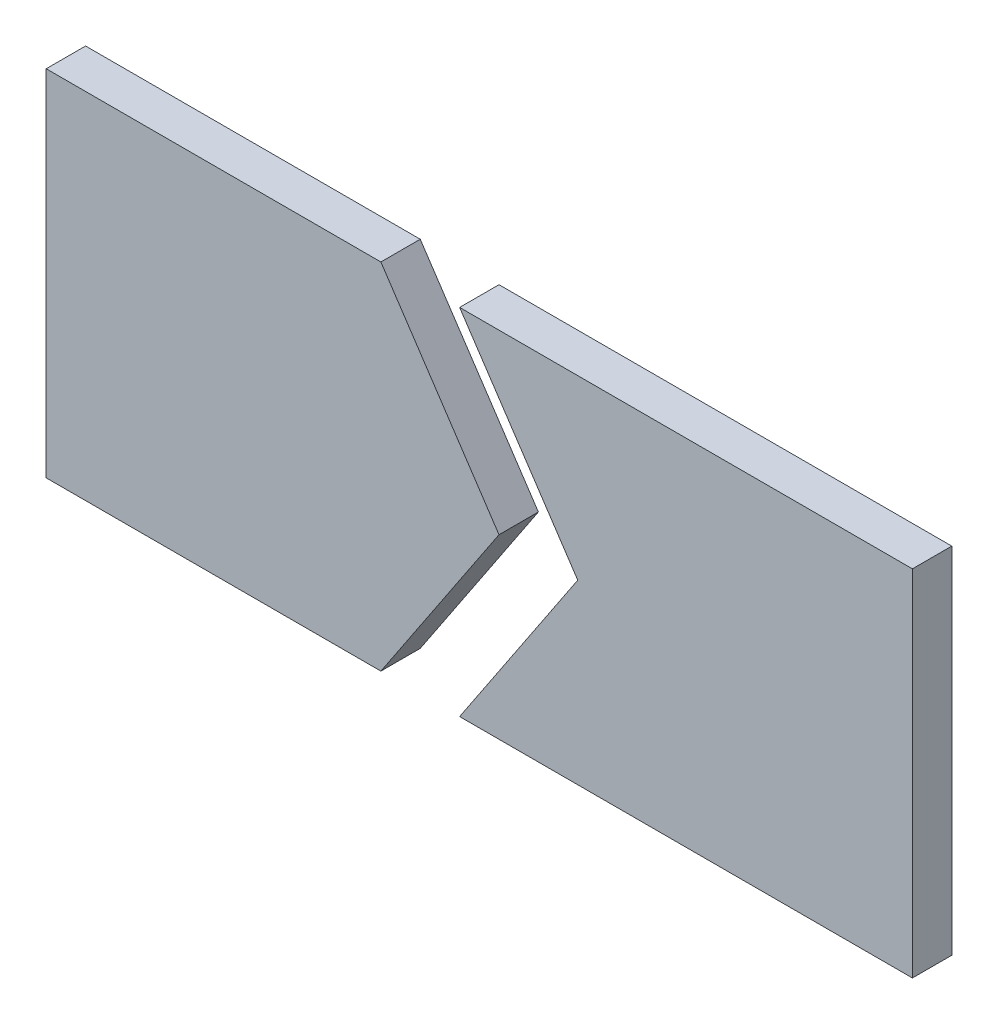
ISO-10303-21;
HEADER;
FILE_DESCRIPTION(('STEP AP214'),'2;1');
FILE_NAME('part.step','',(''),(''),'','','');
FILE_SCHEMA(('AUTOMOTIVE_DESIGN { 1 0 10303 214 1 1 1 1 }'));
ENDSEC;
DATA;
#1=APPLICATION_CONTEXT('core data for automotive mechanical design processes');
#2=APPLICATION_PROTOCOL_DEFINITION('international standard','automotive_design',2000,#1);
#3=PRODUCT_CONTEXT('',#1,'mechanical');
#4=PRODUCT('Part','Part','',(#3));
#5=PRODUCT_RELATED_PRODUCT_CATEGORY('part','',(#4));
#6=PRODUCT_DEFINITION_FORMATION('','',#4);
#7=PRODUCT_DEFINITION_CONTEXT('part definition',#1,'design');
#8=PRODUCT_DEFINITION('design','',#6,#7);
#9=PRODUCT_DEFINITION_SHAPE('','',#8);
#10=(LENGTH_UNIT() NAMED_UNIT(*) SI_UNIT(.MILLI.,.METRE.));
#11=(NAMED_UNIT(*) PLANE_ANGLE_UNIT() SI_UNIT($,.RADIAN.));
#12=(NAMED_UNIT(*) SI_UNIT($,.STERADIAN.) SOLID_ANGLE_UNIT());
#13=UNCERTAINTY_MEASURE_WITH_UNIT(LENGTH_MEASURE(1.E-05),#10,'distance_accuracy_value','');
#14=(GEOMETRIC_REPRESENTATION_CONTEXT(3) GLOBAL_UNCERTAINTY_ASSIGNED_CONTEXT((#13)) GLOBAL_UNIT_ASSIGNED_CONTEXT((#10,
#11,#12)) REPRESENTATION_CONTEXT('',''));
#15=CARTESIAN_POINT('',(0.,0.,0.));
#16=DIRECTION('',(0.,0.,1.));
#17=DIRECTION('',(1.,0.,0.));
#18=AXIS2_PLACEMENT_3D('',#15,#16,#17);
#19=CARTESIAN_POINT('',(1.1,0.45,0.1));
#20=DIRECTION('',(-1.,0.,0.));
#21=DIRECTION('',(0.,-1.,0.));
#22=AXIS2_PLACEMENT_3D('',#19,#20,#21);
#23=PLANE('',#22);
#24=DIRECTION('',(0.,1.,0.));
#25=VECTOR('',#24,1.);
#26=CARTESIAN_POINT('',(1.1,0.45,0.));
#27=LINE('',#26,#25);
#28=CARTESIAN_POINT('',(1.1,-0.45,0.));
#29=VERTEX_POINT('',#28);
#30=CARTESIAN_POINT('',(1.1,0.45,0.));
#31=VERTEX_POINT('',#30);
#32=EDGE_CURVE('E120',#29,#31,#27,.T.);
#33=ORIENTED_EDGE('',*,*,#32,.T.);
#34=DIRECTION('',(0.,0.,-1.));
#35=VECTOR('',#34,1.);
#36=CARTESIAN_POINT('',(1.1,0.45,0.1));
#37=LINE('',#36,#35);
#38=CARTESIAN_POINT('',(1.1,0.45,0.1));
#39=VERTEX_POINT('',#38);
#40=EDGE_CURVE('E12',#39,#31,#37,.T.);
#41=ORIENTED_EDGE('',*,*,#40,.F.);
#42=DIRECTION('',(0.,1.,0.));
#43=VECTOR('',#42,1.);
#44=CARTESIAN_POINT('',(1.1,0.45,0.1));
#45=LINE('',#44,#43);
#46=CARTESIAN_POINT('',(1.1,-0.45,0.1));
#47=VERTEX_POINT('',#46);
#48=EDGE_CURVE('E129',#47,#39,#45,.T.);
#49=ORIENTED_EDGE('',*,*,#48,.F.);
#50=DIRECTION('',(0.,0.,-1.));
#51=VECTOR('',#50,1.);
#52=CARTESIAN_POINT('',(1.1,-0.45,0.1));
#53=LINE('',#52,#51);
#54=EDGE_CURVE('E116',#47,#29,#53,.T.);
#55=ORIENTED_EDGE('',*,*,#54,.T.);
#56=EDGE_LOOP('',(#33,#41,#49,#55));
#57=FACE_BOUND('',#56,.T.);
#58=ADVANCED_FACE('F45',(#57),#23,.F.);
#59=CARTESIAN_POINT('',(0.5,0.45,0.1));
#60=DIRECTION('',(0.,-1.,0.));
#61=DIRECTION('',(1.,0.,0.));
#62=AXIS2_PLACEMENT_3D('',#59,#60,#61);
#63=PLANE('',#62);
#64=DIRECTION('',(-1.,0.,0.));
#65=VECTOR('',#64,1.);
#66=CARTESIAN_POINT('',(0.5,0.45,0.));
#67=LINE('',#66,#65);
#68=CARTESIAN_POINT('',(-0.0499999999999999,0.45,0.));
#69=VERTEX_POINT('',#68);
#70=EDGE_CURVE('E123',#31,#69,#67,.T.);
#71=ORIENTED_EDGE('',*,*,#70,.T.);
#72=DIRECTION('',(0.,0.,-1.));
#73=VECTOR('',#72,1.);
#74=CARTESIAN_POINT('',(-0.0499999999999999,0.45,0.1));
#75=LINE('',#74,#73);
#76=CARTESIAN_POINT('',(-0.0499999999999999,0.45,0.1));
#77=VERTEX_POINT('',#76);
#78=EDGE_CURVE('E53',#77,#69,#75,.T.);
#79=ORIENTED_EDGE('',*,*,#78,.F.);
#80=DIRECTION('',(-1.,0.,0.));
#81=VECTOR('',#80,1.);
#82=CARTESIAN_POINT('',(1.1,0.45,0.1));
#83=LINE('',#82,#81);
#84=EDGE_CURVE('E93',#39,#77,#83,.T.);
#85=ORIENTED_EDGE('',*,*,#84,.F.);
#86=ORIENTED_EDGE('',*,*,#40,.T.);
#87=EDGE_LOOP('',(#71,#79,#85,#86));
#88=FACE_BOUND('',#87,.T.);
#89=ADVANCED_FACE('F137',(#88),#63,.F.);
#90=CARTESIAN_POINT('',(-0.0499999999999999,0.45,0.1));
#91=DIRECTION('',(0.832050294337844,0.554700196225229,0.));
#92=DIRECTION('',(-0.554700196225229,0.832050294337844,0.));
#93=AXIS2_PLACEMENT_3D('',#90,#91,#92);
#94=PLANE('',#93);
#95=DIRECTION('',(0.554700196225229,-0.832050294337844,0.));
#96=VECTOR('',#95,1.);
#97=CARTESIAN_POINT('',(-0.0499999999999999,0.45,0.));
#98=LINE('',#97,#96);
#99=CARTESIAN_POINT('',(0.25,0.,0.));
#100=VERTEX_POINT('',#99);
#101=EDGE_CURVE('E110',#69,#100,#98,.T.);
#102=ORIENTED_EDGE('',*,*,#101,.T.);
#103=DIRECTION('',(0.,0.,-1.));
#104=VECTOR('',#103,1.);
#105=CARTESIAN_POINT('',(0.25,0.,0.1));
#106=LINE('',#105,#104);
#107=CARTESIAN_POINT('',(0.25,0.,0.1));
#108=VERTEX_POINT('',#107);
#109=EDGE_CURVE('E107',#108,#100,#106,.T.);
#110=ORIENTED_EDGE('',*,*,#109,.F.);
#111=DIRECTION('',(0.554700196225229,-0.832050294337844,0.));
#112=VECTOR('',#111,1.);
#113=CARTESIAN_POINT('',(-0.0499999999999999,0.45,0.1));
#114=LINE('',#113,#112);
#115=EDGE_CURVE('E97',#77,#108,#114,.T.);
#116=ORIENTED_EDGE('',*,*,#115,.F.);
#117=ORIENTED_EDGE('',*,*,#78,.T.);
#118=EDGE_LOOP('',(#102,#110,#116,#117));
#119=FACE_BOUND('',#118,.T.);
#120=ADVANCED_FACE('F108',(#119),#94,.F.);
#121=CARTESIAN_POINT('',(-0.0499999999999999,-0.45,0.1));
#122=DIRECTION('',(0.832050294337844,-0.554700196225229,0.));
#123=DIRECTION('',(0.554700196225229,0.832050294337844,0.));
#124=AXIS2_PLACEMENT_3D('',#121,#122,#123);
#125=PLANE('',#124);
#126=DIRECTION('',(-0.554700196225229,-0.832050294337844,0.));
#127=VECTOR('',#126,1.);
#128=CARTESIAN_POINT('',(-0.0499999999999999,-0.45,0.));
#129=LINE('',#128,#127);
#130=CARTESIAN_POINT('',(-0.0499999999999999,-0.45,0.));
#131=VERTEX_POINT('',#130);
#132=EDGE_CURVE('E126',#100,#131,#129,.T.);
#133=ORIENTED_EDGE('',*,*,#132,.T.);
#134=DIRECTION('',(0.,0.,-1.));
#135=VECTOR('',#134,1.);
#136=CARTESIAN_POINT('',(-0.0499999999999999,-0.45,0.1));
#137=LINE('',#136,#135);
#138=CARTESIAN_POINT('',(-0.0499999999999999,-0.45,0.1));
#139=VERTEX_POINT('',#138);
#140=EDGE_CURVE('E112',#139,#131,#137,.T.);
#141=ORIENTED_EDGE('',*,*,#140,.F.);
#142=DIRECTION('',(-0.554700196225229,-0.832050294337844,0.));
#143=VECTOR('',#142,1.);
#144=CARTESIAN_POINT('',(-0.0499999999999999,-0.45,0.1));
#145=LINE('',#144,#143);
#146=EDGE_CURVE('E101',#108,#139,#145,.T.);
#147=ORIENTED_EDGE('',*,*,#146,.F.);
#148=ORIENTED_EDGE('',*,*,#109,.T.);
#149=EDGE_LOOP('',(#133,#141,#147,#148));
#150=FACE_BOUND('',#149,.T.);
#151=ADVANCED_FACE('F114',(#150),#125,.F.);
#152=CARTESIAN_POINT('',(1.1,-0.45,0.1));
#153=DIRECTION('',(0.,1.,0.));
#154=DIRECTION('',(-1.,0.,0.));
#155=AXIS2_PLACEMENT_3D('',#152,#153,#154);
#156=PLANE('',#155);
#157=DIRECTION('',(1.,0.,0.));
#158=VECTOR('',#157,1.);
#159=CARTESIAN_POINT('',(1.1,-0.45,0.));
#160=LINE('',#159,#158);
#161=EDGE_CURVE('E81',#131,#29,#160,.T.);
#162=ORIENTED_EDGE('',*,*,#161,.T.);
#163=ORIENTED_EDGE('',*,*,#54,.F.);
#164=DIRECTION('',(1.,0.,0.));
#165=VECTOR('',#164,1.);
#166=CARTESIAN_POINT('',(0.5,-0.45,0.1));
#167=LINE('',#166,#165);
#168=EDGE_CURVE('E61',#139,#47,#167,.T.);
#169=ORIENTED_EDGE('',*,*,#168,.F.);
#170=ORIENTED_EDGE('',*,*,#140,.T.);
#171=EDGE_LOOP('',(#162,#163,#169,#170));
#172=FACE_BOUND('',#171,.T.);
#173=ADVANCED_FACE('F132',(#172),#156,.F.);
#174=CARTESIAN_POINT('',(0.,0.,0.1));
#175=DIRECTION('',(0.,0.,-1.));
#176=DIRECTION('',(-1.,0.,0.));
#177=AXIS2_PLACEMENT_3D('',#174,#175,#176);
#178=PLANE('',#177);
#179=ORIENTED_EDGE('',*,*,#48,.T.);
#180=ORIENTED_EDGE('',*,*,#84,.T.);
#181=ORIENTED_EDGE('',*,*,#115,.T.);
#182=ORIENTED_EDGE('',*,*,#146,.T.);
#183=ORIENTED_EDGE('',*,*,#168,.T.);
#184=EDGE_LOOP('',(#179,#180,#181,#182,#183));
#185=FACE_BOUND('',#184,.T.);
#186=ADVANCED_FACE('F99',(#185),#178,.F.);
#187=CARTESIAN_POINT('',(0.,0.,0.));
#188=DIRECTION('',(0.,0.,-1.));
#189=DIRECTION('',(-1.,0.,0.));
#190=AXIS2_PLACEMENT_3D('',#187,#188,#189);
#191=PLANE('',#190);
#192=ORIENTED_EDGE('',*,*,#32,.F.);
#193=ORIENTED_EDGE('',*,*,#161,.F.);
#194=ORIENTED_EDGE('',*,*,#132,.F.);
#195=ORIENTED_EDGE('',*,*,#101,.F.);
#196=ORIENTED_EDGE('',*,*,#70,.F.);
#197=EDGE_LOOP('',(#192,#193,#194,#195,#196));
#198=FACE_BOUND('',#197,.T.);
#199=ADVANCED_FACE('F131',(#198),#191,.T.);
#200=CLOSED_SHELL('',(#58,#89,#120,#151,#173,#186,#199));
#201=MANIFOLD_SOLID_BREP('B2',#200);
#202=CARTESIAN_POINT('',(-0.25,-0.45,0.1));
#203=DIRECTION('',(-0.832050294337843,0.554700196225229,0.));
#204=DIRECTION('',(-0.554700196225229,-0.832050294337844,0.));
#205=AXIS2_PLACEMENT_3D('',#202,#203,#204);
#206=PLANE('',#205);
#207=DIRECTION('',(0.554700196225229,0.832050294337843,0.));
#208=VECTOR('',#207,1.);
#209=CARTESIAN_POINT('',(-0.25,-0.45,0.));
#210=LINE('',#209,#208);
#211=CARTESIAN_POINT('',(-0.25,-0.45,0.));
#212=VERTEX_POINT('',#211);
#213=CARTESIAN_POINT('',(0.05,0.,0.));
#214=VERTEX_POINT('',#213);
#215=EDGE_CURVE('E279',#212,#214,#210,.T.);
#216=ORIENTED_EDGE('',*,*,#215,.T.);
#217=DIRECTION('',(0.,0.,-1.));
#218=VECTOR('',#217,1.);
#219=CARTESIAN_POINT('',(0.05,0.,0.1));
#220=LINE('',#219,#218);
#221=CARTESIAN_POINT('',(0.05,0.,0.1));
#222=VERTEX_POINT('',#221);
#223=EDGE_CURVE('E209',#222,#214,#220,.T.);
#224=ORIENTED_EDGE('',*,*,#223,.F.);
#225=DIRECTION('',(0.554700196225229,0.832050294337843,0.));
#226=VECTOR('',#225,1.);
#227=CARTESIAN_POINT('',(-0.25,-0.45,0.1));
#228=LINE('',#227,#226);
#229=CARTESIAN_POINT('',(-0.25,-0.45,0.1));
#230=VERTEX_POINT('',#229);
#231=EDGE_CURVE('E251',#230,#222,#228,.T.);
#232=ORIENTED_EDGE('',*,*,#231,.F.);
#233=DIRECTION('',(0.,0.,-1.));
#234=VECTOR('',#233,1.);
#235=CARTESIAN_POINT('',(-0.25,-0.45,0.1));
#236=LINE('',#235,#234);
#237=EDGE_CURVE('E43',#230,#212,#236,.T.);
#238=ORIENTED_EDGE('',*,*,#237,.T.);
#239=EDGE_LOOP('',(#216,#224,#232,#238));
#240=FACE_BOUND('',#239,.T.);
#241=ADVANCED_FACE('F201',(#240),#206,.F.);
#242=CARTESIAN_POINT('',(-0.25,0.45,0.1));
#243=DIRECTION('',(-0.832050294337843,-0.554700196225229,0.));
#244=DIRECTION('',(0.554700196225229,-0.832050294337844,0.));
#245=AXIS2_PLACEMENT_3D('',#242,#243,#244);
#246=PLANE('',#245);
#247=DIRECTION('',(-0.554700196225229,0.832050294337843,0.));
#248=VECTOR('',#247,1.);
#249=CARTESIAN_POINT('',(-0.25,0.45,0.));
#250=LINE('',#249,#248);
#251=CARTESIAN_POINT('',(-0.25,0.45,0.));
#252=VERTEX_POINT('',#251);
#253=EDGE_CURVE('E268',#214,#252,#250,.T.);
#254=ORIENTED_EDGE('',*,*,#253,.T.);
#255=DIRECTION('',(0.,0.,-1.));
#256=VECTOR('',#255,1.);
#257=CARTESIAN_POINT('',(-0.25,0.45,0.1));
#258=LINE('',#257,#256);
#259=CARTESIAN_POINT('',(-0.25,0.45,0.1));
#260=VERTEX_POINT('',#259);
#261=EDGE_CURVE('E265',#260,#252,#258,.T.);
#262=ORIENTED_EDGE('',*,*,#261,.F.);
#263=DIRECTION('',(-0.554700196225229,0.832050294337843,0.));
#264=VECTOR('',#263,1.);
#265=CARTESIAN_POINT('',(-0.25,0.45,0.1));
#266=LINE('',#265,#264);
#267=EDGE_CURVE('E256',#222,#260,#266,.T.);
#268=ORIENTED_EDGE('',*,*,#267,.F.);
#269=ORIENTED_EDGE('',*,*,#223,.T.);
#270=EDGE_LOOP('',(#254,#262,#268,#269));
#271=FACE_BOUND('',#270,.T.);
#272=ADVANCED_FACE('F266',(#271),#246,.F.);
#273=CARTESIAN_POINT('',(-1.1,0.45,0.1));
#274=DIRECTION('',(0.,-1.,0.));
#275=DIRECTION('',(1.,0.,0.));
#276=AXIS2_PLACEMENT_3D('',#273,#274,#275);
#277=PLANE('',#276);
#278=DIRECTION('',(-1.,0.,0.));
#279=VECTOR('',#278,1.);
#280=CARTESIAN_POINT('',(-1.1,0.45,0.));
#281=LINE('',#280,#279);
#282=CARTESIAN_POINT('',(-1.1,0.45,0.));
#283=VERTEX_POINT('',#282);
#284=EDGE_CURVE('E237',#252,#283,#281,.T.);
#285=ORIENTED_EDGE('',*,*,#284,.T.);
#286=DIRECTION('',(0.,0.,-1.));
#287=VECTOR('',#286,1.);
#288=CARTESIAN_POINT('',(-1.1,0.45,0.1));
#289=LINE('',#288,#287);
#290=CARTESIAN_POINT('',(-1.1,0.45,0.1));
#291=VERTEX_POINT('',#290);
#292=EDGE_CURVE('E269',#291,#283,#289,.T.);
#293=ORIENTED_EDGE('',*,*,#292,.F.);
#294=DIRECTION('',(-1.,0.,0.));
#295=VECTOR('',#294,1.);
#296=CARTESIAN_POINT('',(-0.5,0.45,0.1));
#297=LINE('',#296,#295);
#298=EDGE_CURVE('E260',#260,#291,#297,.T.);
#299=ORIENTED_EDGE('',*,*,#298,.F.);
#300=ORIENTED_EDGE('',*,*,#261,.T.);
#301=EDGE_LOOP('',(#285,#293,#299,#300));
#302=FACE_BOUND('',#301,.T.);
#303=ADVANCED_FACE('F271',(#302),#277,.F.);
#304=CARTESIAN_POINT('',(-1.1,0.45,0.1));
#305=DIRECTION('',(1.,0.,0.));
#306=DIRECTION('',(0.,0.,-1.));
#307=AXIS2_PLACEMENT_3D('',#304,#305,#306);
#308=PLANE('',#307);
#309=DIRECTION('',(0.,-1.,0.));
#310=VECTOR('',#309,1.);
#311=CARTESIAN_POINT('',(-1.1,0.45,0.));
#312=LINE('',#311,#310);
#313=CARTESIAN_POINT('',(-1.1,-0.45,0.));
#314=VERTEX_POINT('',#313);
#315=EDGE_CURVE('E244',#283,#314,#312,.T.);
#316=ORIENTED_EDGE('',*,*,#315,.T.);
#317=DIRECTION('',(0.,0.,-1.));
#318=VECTOR('',#317,1.);
#319=CARTESIAN_POINT('',(-1.1,-0.45,0.1));
#320=LINE('',#319,#318);
#321=CARTESIAN_POINT('',(-1.1,-0.45,0.1));
#322=VERTEX_POINT('',#321);
#323=EDGE_CURVE('E275',#322,#314,#320,.T.);
#324=ORIENTED_EDGE('',*,*,#323,.F.);
#325=DIRECTION('',(0.,-1.,0.));
#326=VECTOR('',#325,1.);
#327=CARTESIAN_POINT('',(-1.1,0.45,0.1));
#328=LINE('',#327,#326);
#329=EDGE_CURVE('E273',#291,#322,#328,.T.);
#330=ORIENTED_EDGE('',*,*,#329,.F.);
#331=ORIENTED_EDGE('',*,*,#292,.T.);
#332=EDGE_LOOP('',(#316,#324,#330,#331));
#333=FACE_BOUND('',#332,.T.);
#334=ADVANCED_FACE('F292',(#333),#308,.F.);
#335=CARTESIAN_POINT('',(-1.1,-0.45,0.1));
#336=DIRECTION('',(0.,1.,0.));
#337=DIRECTION('',(-1.,0.,0.));
#338=AXIS2_PLACEMENT_3D('',#335,#336,#337);
#339=PLANE('',#338);
#340=DIRECTION('',(1.,0.,0.));
#341=VECTOR('',#340,1.);
#342=CARTESIAN_POINT('',(-1.1,-0.45,0.));
#343=LINE('',#342,#341);
#344=EDGE_CURVE('E284',#314,#212,#343,.T.);
#345=ORIENTED_EDGE('',*,*,#344,.T.);
#346=ORIENTED_EDGE('',*,*,#237,.F.);
#347=DIRECTION('',(1.,0.,0.));
#348=VECTOR('',#347,1.);
#349=CARTESIAN_POINT('',(-0.5,-0.45,0.1));
#350=LINE('',#349,#348);
#351=EDGE_CURVE('E217',#322,#230,#350,.T.);
#352=ORIENTED_EDGE('',*,*,#351,.F.);
#353=ORIENTED_EDGE('',*,*,#323,.T.);
#354=EDGE_LOOP('',(#345,#346,#352,#353));
#355=FACE_BOUND('',#354,.T.);
#356=ADVANCED_FACE('F291',(#355),#339,.F.);
#357=CARTESIAN_POINT('',(0.,0.,0.1));
#358=DIRECTION('',(0.,0.,-1.));
#359=DIRECTION('',(-1.,0.,0.));
#360=AXIS2_PLACEMENT_3D('',#357,#358,#359);
#361=PLANE('',#360);
#362=ORIENTED_EDGE('',*,*,#351,.T.);
#363=ORIENTED_EDGE('',*,*,#231,.T.);
#364=ORIENTED_EDGE('',*,*,#267,.T.);
#365=ORIENTED_EDGE('',*,*,#298,.T.);
#366=ORIENTED_EDGE('',*,*,#329,.T.);
#367=EDGE_LOOP('',(#362,#363,#364,#365,#366));
#368=FACE_BOUND('',#367,.T.);
#369=ADVANCED_FACE('F258',(#368),#361,.F.);
#370=CARTESIAN_POINT('',(0.,0.,0.));
#371=DIRECTION('',(0.,0.,-1.));
#372=DIRECTION('',(-1.,0.,0.));
#373=AXIS2_PLACEMENT_3D('',#370,#371,#372);
#374=PLANE('',#373);
#375=ORIENTED_EDGE('',*,*,#215,.F.);
#376=ORIENTED_EDGE('',*,*,#344,.F.);
#377=ORIENTED_EDGE('',*,*,#315,.F.);
#378=ORIENTED_EDGE('',*,*,#284,.F.);
#379=ORIENTED_EDGE('',*,*,#253,.F.);
#380=EDGE_LOOP('',(#375,#376,#377,#378,#379));
#381=FACE_BOUND('',#380,.T.);
#382=ADVANCED_FACE('F289',(#381),#374,.T.);
#383=CLOSED_SHELL('',(#241,#272,#303,#334,#356,#369,#382));
#384=MANIFOLD_SOLID_BREP('B6',#383);
#385=ADVANCED_BREP_SHAPE_REPRESENTATION('',(#18,#201,#384),#14);
#386=SHAPE_DEFINITION_REPRESENTATION(#9,#385);
ENDSEC;
END-ISO-10303-21;
